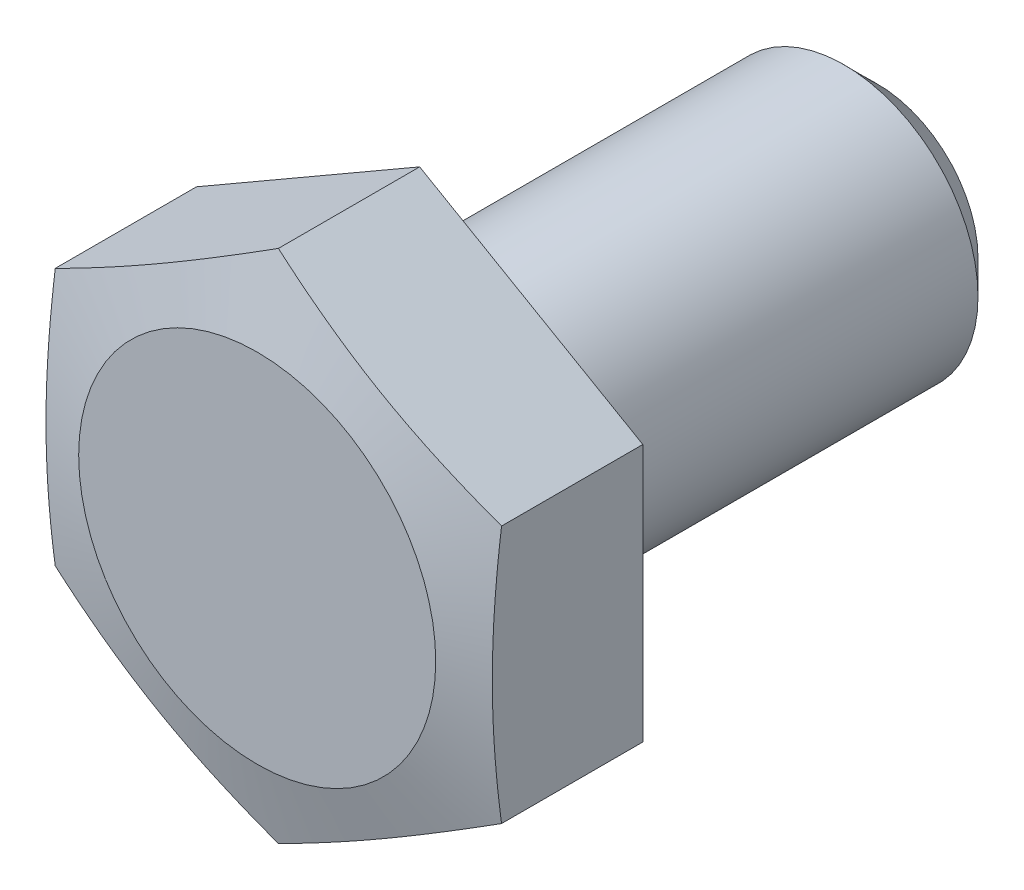
ISO-10303-21;
HEADER;
FILE_DESCRIPTION(('STEP AP214'),'2;1');
FILE_NAME('part.step','',(''),(''),'','','');
FILE_SCHEMA(('AUTOMOTIVE_DESIGN { 1 0 10303 214 1 1 1 1 }'));
ENDSEC;
DATA;
#1=APPLICATION_CONTEXT('core data for automotive mechanical design processes');
#2=APPLICATION_PROTOCOL_DEFINITION('international standard','automotive_design',2000,#1);
#3=PRODUCT_CONTEXT('',#1,'mechanical');
#4=PRODUCT('Part','Part','',(#3));
#5=PRODUCT_RELATED_PRODUCT_CATEGORY('part','',(#4));
#6=PRODUCT_DEFINITION_FORMATION('','',#4);
#7=PRODUCT_DEFINITION_CONTEXT('part definition',#1,'design');
#8=PRODUCT_DEFINITION('design','',#6,#7);
#9=PRODUCT_DEFINITION_SHAPE('','',#8);
#10=(LENGTH_UNIT() NAMED_UNIT(*) SI_UNIT(.MILLI.,.METRE.));
#11=(NAMED_UNIT(*) PLANE_ANGLE_UNIT() SI_UNIT($,.RADIAN.));
#12=(NAMED_UNIT(*) SI_UNIT($,.STERADIAN.) SOLID_ANGLE_UNIT());
#13=UNCERTAINTY_MEASURE_WITH_UNIT(LENGTH_MEASURE(1.E-05),#10,'distance_accuracy_value','');
#14=(GEOMETRIC_REPRESENTATION_CONTEXT(3) GLOBAL_UNCERTAINTY_ASSIGNED_CONTEXT((#13)) GLOBAL_UNIT_ASSIGNED_CONTEXT((#10,
#11,#12)) REPRESENTATION_CONTEXT('',''));
#15=CARTESIAN_POINT('',(0.,0.,0.));
#16=DIRECTION('',(0.,0.,1.));
#17=DIRECTION('',(1.,0.,0.));
#18=AXIS2_PLACEMENT_3D('',#15,#16,#17);
#19=CARTESIAN_POINT('',(0.,0.,0.));
#20=DIRECTION('',(0.,0.,1.));
#21=DIRECTION('',(1.,0.,0.));
#22=AXIS2_PLACEMENT_3D('',#19,#20,#21);
#23=PLANE('',#22);
#24=CARTESIAN_POINT('',(0.,0.,0.));
#25=DIRECTION('',(0.,0.,1.));
#26=DIRECTION('',(1.,0.,0.));
#27=AXIS2_PLACEMENT_3D('',#24,#25,#26);
#28=CIRCLE('',#27,3.1);
#29=CARTESIAN_POINT('',(3.1,0.,0.));
#30=VERTEX_POINT('',#29);
#31=EDGE_CURVE('E66',#30,#30,#28,.T.);
#32=ORIENTED_EDGE('',*,*,#31,.T.);
#33=EDGE_LOOP('',(#32));
#34=FACE_BOUND('',#33,.T.);
#35=CARTESIAN_POINT('',(0.,0.,0.));
#36=DIRECTION('',(0.,0.,1.));
#37=DIRECTION('',(1.,0.,0.));
#38=AXIS2_PLACEMENT_3D('',#35,#36,#37);
#39=CIRCLE('',#38,4.5);
#40=CARTESIAN_POINT('',(4.5,0.,0.));
#41=VERTEX_POINT('',#40);
#42=EDGE_CURVE('E362',#41,#41,#39,.T.);
#43=ORIENTED_EDGE('',*,*,#42,.F.);
#44=EDGE_LOOP('',(#43));
#45=FACE_BOUND('',#44,.T.);
#46=ADVANCED_FACE('F58',(#34,#45),#23,.F.);
#47=CARTESIAN_POINT('',(0.,0.,-10.));
#48=DIRECTION('',(0.,0.,1.));
#49=DIRECTION('',(1.,0.,0.));
#50=AXIS2_PLACEMENT_3D('',#47,#48,#49);
#51=CYLINDRICAL_SURFACE('',#50,3.);
#52=CARTESIAN_POINT('',(0.,0.,-0.0999999999999994));
#53=DIRECTION('',(0.,0.,1.));
#54=DIRECTION('',(1.,0.,0.));
#55=AXIS2_PLACEMENT_3D('',#52,#53,#54);
#56=CIRCLE('',#55,3.);
#57=CARTESIAN_POINT('',(3.,0.,-0.0999999999999994));
#58=VERTEX_POINT('',#57);
#59=EDGE_CURVE('E13',#58,#58,#56,.F.);
#60=ORIENTED_EDGE('',*,*,#59,.T.);
#61=EDGE_LOOP('',(#60));
#62=FACE_BOUND('',#61,.T.);
#63=CARTESIAN_POINT('',(0.,0.,-9.24999999999999));
#64=DIRECTION('',(0.,0.,1.));
#65=DIRECTION('',(1.,0.,0.));
#66=AXIS2_PLACEMENT_3D('',#63,#64,#65);
#67=CIRCLE('',#66,3.);
#68=CARTESIAN_POINT('',(3.,0.,-9.24999999999999));
#69=VERTEX_POINT('',#68);
#70=EDGE_CURVE('E147',#69,#69,#67,.T.);
#71=ORIENTED_EDGE('',*,*,#70,.T.);
#72=EDGE_LOOP('',(#71));
#73=FACE_BOUND('',#72,.T.);
#74=ADVANCED_FACE('F168',(#62,#73),#51,.T.);
#75=CARTESIAN_POINT('',(0.,0.,-10.));
#76=DIRECTION('',(0.,0.,1.));
#77=DIRECTION('',(1.,0.,0.));
#78=AXIS2_PLACEMENT_3D('',#75,#76,#77);
#79=PLANE('',#78);
#80=CARTESIAN_POINT('',(0.,0.,-10.));
#81=DIRECTION('',(0.,0.,1.));
#82=DIRECTION('',(1.,0.,0.));
#83=AXIS2_PLACEMENT_3D('',#80,#81,#82);
#84=CIRCLE('',#83,2.24999999999999);
#85=CARTESIAN_POINT('',(2.24999999999999,0.,-10.));
#86=VERTEX_POINT('',#85);
#87=EDGE_CURVE('E117',#86,#86,#84,.F.);
#88=ORIENTED_EDGE('',*,*,#87,.T.);
#89=EDGE_LOOP('',(#88));
#90=FACE_BOUND('',#89,.T.);
#91=ADVANCED_FACE('F173',(#90),#79,.F.);
#92=CARTESIAN_POINT('',(0.,0.,-9.24999999999999));
#93=DIRECTION('',(0.,0.,1.));
#94=DIRECTION('',(1.,0.,0.));
#95=AXIS2_PLACEMENT_3D('',#92,#93,#94);
#96=CONICAL_SURFACE('',#95,3.,0.785398163397453);
#97=CARTESIAN_POINT('',(2.24999999999999,0.,-10.));
#98=CARTESIAN_POINT('',(2.25781249999999,0.,-9.9921875));
#99=CARTESIAN_POINT('',(2.26562499999999,0.,-9.984375));
#100=CARTESIAN_POINT('',(2.28124999999999,0.,-9.96875));
#101=CARTESIAN_POINT('',(2.28906249999999,0.,-9.9609375));
#102=CARTESIAN_POINT('',(2.30468749999999,0.,-9.9453125));
#103=CARTESIAN_POINT('',(2.31249999999999,0.,-9.9375));
#104=CARTESIAN_POINT('',(2.32812499999999,0.,-9.921875));
#105=CARTESIAN_POINT('',(2.33593749999999,0.,-9.9140625));
#106=CARTESIAN_POINT('',(2.35156249999999,0.,-9.8984375));
#107=CARTESIAN_POINT('',(2.35937499999999,0.,-9.890625));
#108=CARTESIAN_POINT('',(2.37499999999999,0.,-9.875));
#109=CARTESIAN_POINT('',(2.38281249999999,0.,-9.8671875));
#110=CARTESIAN_POINT('',(2.39843749999999,0.,-9.8515625));
#111=CARTESIAN_POINT('',(2.40624999999999,0.,-9.84375));
#112=CARTESIAN_POINT('',(2.42187499999999,0.,-9.828125));
#113=CARTESIAN_POINT('',(2.42968749999999,0.,-9.8203125));
#114=CARTESIAN_POINT('',(2.44531249999999,0.,-9.8046875));
#115=CARTESIAN_POINT('',(2.45312499999999,0.,-9.796875));
#116=CARTESIAN_POINT('',(2.46874999999999,0.,-9.78125));
#117=CARTESIAN_POINT('',(2.47656249999999,0.,-9.7734375));
#118=CARTESIAN_POINT('',(2.49218749999999,0.,-9.7578125));
#119=CARTESIAN_POINT('',(2.49999999999999,0.,-9.75));
#120=CARTESIAN_POINT('',(2.51562499999999,0.,-9.734375));
#121=CARTESIAN_POINT('',(2.52343749999999,0.,-9.7265625));
#122=CARTESIAN_POINT('',(2.53906249999999,0.,-9.7109375));
#123=CARTESIAN_POINT('',(2.54687499999999,0.,-9.703125));
#124=CARTESIAN_POINT('',(2.56249999999999,0.,-9.6875));
#125=CARTESIAN_POINT('',(2.57031249999999,0.,-9.6796875));
#126=CARTESIAN_POINT('',(2.58593749999999,0.,-9.6640625));
#127=CARTESIAN_POINT('',(2.59374999999999,0.,-9.65625));
#128=CARTESIAN_POINT('',(2.60937499999999,0.,-9.640625));
#129=CARTESIAN_POINT('',(2.61718749999999,0.,-9.6328125));
#130=CARTESIAN_POINT('',(2.63281249999999,0.,-9.6171875));
#131=CARTESIAN_POINT('',(2.64062499999999,0.,-9.609375));
#132=CARTESIAN_POINT('',(2.65624999999999,0.,-9.59375));
#133=CARTESIAN_POINT('',(2.66406249999999,0.,-9.5859375));
#134=CARTESIAN_POINT('',(2.67968749999999,0.,-9.5703125));
#135=CARTESIAN_POINT('',(2.68749999999999,0.,-9.5625));
#136=CARTESIAN_POINT('',(2.70312499999999,0.,-9.546875));
#137=CARTESIAN_POINT('',(2.71093749999999,0.,-9.5390625));
#138=CARTESIAN_POINT('',(2.7265625,0.,-9.5234375));
#139=CARTESIAN_POINT('',(2.734375,0.,-9.515625));
#140=CARTESIAN_POINT('',(2.75,0.,-9.5));
#141=CARTESIAN_POINT('',(2.7578125,0.,-9.4921875));
#142=CARTESIAN_POINT('',(2.7734375,0.,-9.4765625));
#143=CARTESIAN_POINT('',(2.78125,0.,-9.46875));
#144=CARTESIAN_POINT('',(2.796875,0.,-9.453125));
#145=CARTESIAN_POINT('',(2.8046875,0.,-9.4453125));
#146=CARTESIAN_POINT('',(2.8203125,0.,-9.4296875));
#147=CARTESIAN_POINT('',(2.828125,0.,-9.421875));
#148=CARTESIAN_POINT('',(2.84375,0.,-9.40625));
#149=CARTESIAN_POINT('',(2.8515625,0.,-9.3984375));
#150=CARTESIAN_POINT('',(2.8671875,0.,-9.38281249999999));
#151=CARTESIAN_POINT('',(2.875,0.,-9.375));
#152=CARTESIAN_POINT('',(2.890625,0.,-9.359375));
#153=CARTESIAN_POINT('',(2.8984375,0.,-9.35156249999999));
#154=CARTESIAN_POINT('',(2.9140625,0.,-9.33593749999999));
#155=CARTESIAN_POINT('',(2.921875,0.,-9.328125));
#156=CARTESIAN_POINT('',(2.9375,0.,-9.3125));
#157=CARTESIAN_POINT('',(2.9453125,0.,-9.30468749999999));
#158=CARTESIAN_POINT('',(2.9609375,0.,-9.28906249999999));
#159=CARTESIAN_POINT('',(2.96875,0.,-9.28125));
#160=CARTESIAN_POINT('',(2.984375,0.,-9.26562499999999));
#161=CARTESIAN_POINT('',(2.9921875,0.,-9.25781249999999));
#162=CARTESIAN_POINT('',(3.,0.,-9.24999999999999));
#163=B_SPLINE_CURVE_WITH_KNOTS('',3,(#97,#98,#99,#100,#101,#102,#103,#104,#105,#106,#107,#108,
#109,#110,#111,#112,#113,#114,#115,#116,#117,#118,#119,#120,#121,#122,#123,#124,#125,#126,#127,
#128,#129,#130,#131,#132,#133,#134,#135,#136,#137,#138,#139,#140,#141,#142,#143,#144,#145,#146,
#147,#148,#149,#150,#151,#152,#153,#154,#155,#156,#157,#158,#159,#160,#161,#162),.UNSPECIFIED.,
.F.,.F.,(4,2,2,2,2,2,2,2,2,2,2,2,2,2,2,2,2,2,2,2,2,2,2,2,2,2,2,2,2,2,2,2,4),(0.,
0.0331456303681191,0.0662912607362395,0.0994368911043586,0.132582521472479,0.165728151840599,
0.198873782208718,0.232019412576839,0.265165042944958,0.298310673313078,0.331456303681197,
0.364601934049318,0.397747564417438,0.430893194785557,0.464038825153678,0.497184455521797,
0.530330085889917,0.563475716258037,0.596621346626156,0.629766976994277,0.662912607362396,
0.696058237730516,0.729203868098636,0.762349498466756,0.795495128834876,0.828640759202995,
0.861786389571115,0.894932019939235,0.928077650307355,0.961223280675475,0.994368911043594,
1.02751454141171,1.06066017177983),.UNSPECIFIED.);
#164=EDGE_CURVE('BSEAM241',#86,#69,#163,.T.);
#165=ORIENTED_EDGE('',*,*,#87,.F.);
#166=ORIENTED_EDGE('',*,*,#70,.F.);
#167=ORIENTED_EDGE('',*,*,#164,.T.);
#168=ORIENTED_EDGE('',*,*,#164,.F.);
#169=EDGE_LOOP('',(#165,#167,#166,#168));
#170=FACE_BOUND('',#169,.T.);
#171=ADVANCED_FACE('F241',(#170),#96,.T.);
#172=CARTESIAN_POINT('',(0.,0.,0.26));
#173=DIRECTION('',(0.,0.,1.));
#174=DIRECTION('',(1.,0.,0.));
#175=AXIS2_PLACEMENT_3D('',#172,#173,#174);
#176=PLANE('',#175);
#177=CARTESIAN_POINT('',(0.,0.,0.26));
#178=DIRECTION('',(0.,0.,1.));
#179=DIRECTION('',(1.,0.,0.));
#180=AXIS2_PLACEMENT_3D('',#177,#178,#179);
#181=CIRCLE('',#180,4.5);
#182=CARTESIAN_POINT('',(4.5,0.,0.26));
#183=VERTEX_POINT('',#182);
#184=EDGE_CURVE('E127',#183,#183,#181,.T.);
#185=ORIENTED_EDGE('',*,*,#184,.T.);
#186=EDGE_LOOP('',(#185));
#187=FACE_BOUND('',#186,.T.);
#188=DIRECTION('',(0.,1.,0.));
#189=VECTOR('',#188,1.);
#190=CARTESIAN_POINT('',(5.,-2.88675134594813,0.26));
#191=LINE('',#190,#189);
#192=CARTESIAN_POINT('',(5.,-2.88675134594813,0.26));
#193=VERTEX_POINT('',#192);
#194=CARTESIAN_POINT('',(5.,2.88675134594813,0.26));
#195=VERTEX_POINT('',#194);
#196=EDGE_CURVE('E108',#193,#195,#191,.T.);
#197=ORIENTED_EDGE('',*,*,#196,.F.);
#198=DIRECTION('',(0.866025403784439,0.5,0.));
#199=VECTOR('',#198,1.);
#200=CARTESIAN_POINT('',(0.,-5.77350269189626,0.26));
#201=LINE('',#200,#199);
#202=CARTESIAN_POINT('',(0.,-5.77350269189626,0.26));
#203=VERTEX_POINT('',#202);
#204=EDGE_CURVE('E111',#203,#193,#201,.T.);
#205=ORIENTED_EDGE('',*,*,#204,.F.);
#206=DIRECTION('',(0.866025403784439,-0.5,0.));
#207=VECTOR('',#206,1.);
#208=CARTESIAN_POINT('',(-5.,-2.88675134594813,0.26));
#209=LINE('',#208,#207);
#210=CARTESIAN_POINT('',(-5.,-2.88675134594813,0.26));
#211=VERTEX_POINT('',#210);
#212=EDGE_CURVE('E126',#211,#203,#209,.T.);
#213=ORIENTED_EDGE('',*,*,#212,.F.);
#214=DIRECTION('',(0.,-1.,0.));
#215=VECTOR('',#214,1.);
#216=CARTESIAN_POINT('',(-5.,2.88675134594813,0.26));
#217=LINE('',#216,#215);
#218=CARTESIAN_POINT('',(-5.,2.88675134594813,0.26));
#219=VERTEX_POINT('',#218);
#220=EDGE_CURVE('E354',#219,#211,#217,.T.);
#221=ORIENTED_EDGE('',*,*,#220,.F.);
#222=DIRECTION('',(-0.866025403784439,-0.5,0.));
#223=VECTOR('',#222,1.);
#224=CARTESIAN_POINT('',(0.,5.77350269189626,0.26));
#225=LINE('',#224,#223);
#226=CARTESIAN_POINT('',(0.,5.77350269189626,0.26));
#227=VERTEX_POINT('',#226);
#228=EDGE_CURVE('E357',#227,#219,#225,.T.);
#229=ORIENTED_EDGE('',*,*,#228,.F.);
#230=DIRECTION('',(-0.866025403784439,0.5,0.));
#231=VECTOR('',#230,1.);
#232=CARTESIAN_POINT('',(5.,2.88675134594813,0.26));
#233=LINE('',#232,#231);
#234=EDGE_CURVE('E73',#195,#227,#233,.T.);
#235=ORIENTED_EDGE('',*,*,#234,.F.);
#236=EDGE_LOOP('',(#197,#205,#213,#221,#229,#235));
#237=FACE_BOUND('',#236,.T.);
#238=ADVANCED_FACE('F110',(#187,#237),#176,.F.);
#239=CARTESIAN_POINT('',(0.,0.,0.26));
#240=DIRECTION('',(0.,0.,-1.));
#241=DIRECTION('',(-1.,0.,0.));
#242=AXIS2_PLACEMENT_3D('',#239,#240,#241);
#243=CYLINDRICAL_SURFACE('',#242,4.5);
#244=ORIENTED_EDGE('',*,*,#184,.F.);
#245=EDGE_LOOP('',(#244));
#246=FACE_BOUND('',#245,.T.);
#247=ORIENTED_EDGE('',*,*,#42,.T.);
#248=EDGE_LOOP('',(#247));
#249=FACE_BOUND('',#248,.T.);
#250=ADVANCED_FACE('F248',(#246,#249),#243,.T.);
#251=CARTESIAN_POINT('',(0.,0.,3.9));
#252=DIRECTION('',(0.,0.,1.));
#253=DIRECTION('',(1.,0.,0.));
#254=AXIS2_PLACEMENT_3D('',#251,#252,#253);
#255=PLANE('',#254);
#256=CARTESIAN_POINT('',(0.,0.,3.9));
#257=DIRECTION('',(0.,0.,-1.));
#258=DIRECTION('',(-1.,0.,0.));
#259=AXIS2_PLACEMENT_3D('',#256,#257,#258);
#260=CIRCLE('',#259,4.);
#261=CARTESIAN_POINT('',(-4.,0.,3.9));
#262=VERTEX_POINT('',#261);
#263=EDGE_CURVE('E193',#262,#262,#260,.T.);
#264=ORIENTED_EDGE('',*,*,#263,.F.);
#265=EDGE_LOOP('',(#264));
#266=FACE_BOUND('',#265,.T.);
#267=ADVANCED_FACE('F178',(#266),#255,.T.);
#268=CARTESIAN_POINT('',(0.,0.,3.9));
#269=DIRECTION('',(0.,0.,-1.));
#270=DIRECTION('',(-1.,0.,0.));
#271=AXIS2_PLACEMENT_3D('',#268,#269,#270);
#272=CONICAL_SURFACE('',#271,4.,1.30899693899575);
#273=ORIENTED_EDGE('',*,*,#263,.T.);
#274=EDGE_LOOP('',(#273));
#275=FACE_BOUND('',#274,.T.);
#276=CARTESIAN_POINT('',(-5.0002,2.88663587589429,3.42476044489613));
#277=CARTESIAN_POINT('',(-4.79254599569434,3.00652497117847,3.45689871138588));
#278=CARTESIAN_POINT('',(-4.58451548167429,3.1266314444476,3.48607499454545));
#279=CARTESIAN_POINT('',(-4.16771975103018,3.36726857173206,3.53733503738883));
#280=CARTESIAN_POINT('',(-3.95895427067026,3.48779937801537,3.55941591599972));
#281=CARTESIAN_POINT('',(-3.54195440146031,3.72855436475577,3.59519603972269));
#282=CARTESIAN_POINT('',(-3.33372283258692,3.8487769170986,3.6089379557021));
#283=CARTESIAN_POINT('',(-2.91699413634292,4.08937534205412,3.62736446336494));
#284=CARTESIAN_POINT('',(-2.70849706817146,4.20975118048816,3.63205080756888));
#285=CARTESIAN_POINT('',(-2.29150293182854,4.45050285735623,3.63205080756888));
#286=CARTESIAN_POINT('',(-2.08300586365708,4.57087869579027,3.62736446336494));
#287=CARTESIAN_POINT('',(-1.66627716741308,4.81147712074579,3.6089379557021));
#288=CARTESIAN_POINT('',(-1.45804559853969,4.93169967308862,3.59519603972269));
#289=CARTESIAN_POINT('',(-1.04104572932974,5.17245465982902,3.55941591599972));
#290=CARTESIAN_POINT('',(-0.832280248969818,5.29298546611233,3.53733503738883));
#291=CARTESIAN_POINT('',(-0.415484518325708,5.53362259339679,3.48607499454545));
#292=CARTESIAN_POINT('',(-0.207454004305664,5.65372906666592,3.45689871138588));
#293=CARTESIAN_POINT('',(0.000200000000000952,5.7736181619501,3.42476044489613));
#294=B_SPLINE_CURVE_WITH_KNOTS('',3,(#276,#277,#278,#279,#280,#281,#282,#283,#284,#285,#286,
#287,#288,#289,#290,#291,#292,#293),.UNSPECIFIED.,.F.,.F.,(4,2,2,2,2,2,2,2,4),(0.,
0.725805237679808,1.45190481561532,2.17425686883392,2.89646911159516,3.6186813543564,
4.34103340757501,5.06713298551051,5.79293822319032),.UNSPECIFIED.);
#295=CARTESIAN_POINT('',(-5.,2.88675134594813,3.42479138593199));
#296=VERTEX_POINT('',#295);
#297=CARTESIAN_POINT('',(0.,5.77350269189626,3.42479138593199));
#298=VERTEX_POINT('',#297);
#299=EDGE_CURVE('E224',#296,#298,#294,.T.);
#300=ORIENTED_EDGE('',*,*,#299,.F.);
#301=CARTESIAN_POINT('',(-5.,-7.71938857293575,2.50740758007849));
#302=CARTESIAN_POINT('',(-5.,-7.49147427168933,2.5586506711407));
#303=CARTESIAN_POINT('',(-5.,-7.26341962327938,2.60928049818289));
#304=CARTESIAN_POINT('',(-5.,-6.80696046487182,2.70898221683248));
#305=CARTESIAN_POINT('',(-5.,-6.57855594068918,2.75805404342194));
#306=CARTESIAN_POINT('',(-5.,-6.12114081846093,2.85434740009249));
#307=CARTESIAN_POINT('',(-5.,-5.89212985971082,2.9015672227117));
#308=CARTESIAN_POINT('',(-5.,-5.43363694023774,2.99366077539556));
#309=CARTESIAN_POINT('',(-5.,-5.20415498336043,3.03853452453708));
#310=CARTESIAN_POINT('',(-5.,-4.74669561473332,3.12498601768013));
#311=CARTESIAN_POINT('',(-5.,-4.51872312275535,3.16658966965695));
#312=CARTESIAN_POINT('',(-5.,-4.06216118292291,3.24625518987446));
#313=CARTESIAN_POINT('',(-5.,-3.83357174836871,3.28431713385075));
#314=CARTESIAN_POINT('',(-5.,-3.37571675111581,3.35606117758773));
#315=CARTESIAN_POINT('',(-5.,-3.14645123580777,3.38974357720939));
#316=CARTESIAN_POINT('',(-5.,-2.68718848722816,3.45175097196975));
#317=CARTESIAN_POINT('',(-5.,-2.45719125269116,3.48007595783829));
#318=CARTESIAN_POINT('',(-5.,-1.99381235919122,3.53058841201233));
#319=CARTESIAN_POINT('',(-5.,-1.76042239852366,3.55270084172098));
#320=CARTESIAN_POINT('',(-5.,-1.29303834898082,3.58927121142274));
#321=CARTESIAN_POINT('',(-5.,-1.05904427428246,3.60372932943009));
#322=CARTESIAN_POINT('',(-5.,-0.590803464055625,3.62414927679565));
#323=CARTESIAN_POINT('',(-5.,-0.356556930570833,3.63011564576264));
#324=CARTESIAN_POINT('',(-5.,0.1119950018632,3.63318477990246));
#325=CARTESIAN_POINT('',(-5.,0.346300400708154,3.63028756066898));
#326=CARTESIAN_POINT('',(-5.,0.815702332550344,3.6157848044719));
#327=CARTESIAN_POINT('',(-5.,1.05079761908674,3.60413973435184));
#328=CARTESIAN_POINT('',(-5.,1.52045390424001,3.57280431062971));
#329=CARTESIAN_POINT('',(-5.,1.7550148730958,3.55311351939736));
#330=CARTESIAN_POINT('',(-5.,2.22359969488492,3.50670213839425));
#331=CARTESIAN_POINT('',(-5.,2.45762304038479,3.47997650447177));
#332=CARTESIAN_POINT('',(-5.,2.92491072170449,3.42063342174126));
#333=CARTESIAN_POINT('',(-5.,3.15817506053191,3.38801599630868));
#334=CARTESIAN_POINT('',(-5.,3.67089843043664,3.31090516163662));
#335=CARTESIAN_POINT('',(-5.,3.95019552214342,3.2653430589873));
#336=CARTESIAN_POINT('',(-5.,4.5078641671335,3.16884457136917));
#337=CARTESIAN_POINT('',(-5.,4.78623567003497,3.11790789863514));
#338=CARTESIAN_POINT('',(-5.,5.34224429024145,3.01189120228595));
#339=CARTESIAN_POINT('',(-5.,5.61988124068023,2.95681030902665));
#340=CARTESIAN_POINT('',(-5.,6.1744943954023,2.84345950223111));
#341=CARTESIAN_POINT('',(-5.,6.4514706124489,2.78518965082479));
#342=CARTESIAN_POINT('',(-5.,7.0050486624742,2.66613430078371));
#343=CARTESIAN_POINT('',(-5.,7.28165018383369,2.60534735809867));
#344=CARTESIAN_POINT('',(-5.,7.83441649328104,2.4818160373549));
#345=CARTESIAN_POINT('',(-5.,8.11058127842605,2.41907164616488));
#346=CARTESIAN_POINT('',(-5.,8.93847178761893,2.2285435952327));
#347=CARTESIAN_POINT('',(-5.,9.48966522946674,2.09844942786497));
#348=CARTESIAN_POINT('',(-5.,10.5827319287434,1.83626115900039));
#349=CARTESIAN_POINT('',(-5.,11.1246197407943,1.70422732451607));
#350=CARTESIAN_POINT('',(-5.,12.2077528662115,1.43746864765053));
#351=CARTESIAN_POINT('',(-5.,12.7489981551808,1.30274370634371));
#352=CARTESIAN_POINT('',(-5.,13.8299959758578,1.03164505898908));
#353=CARTESIAN_POINT('',(-5.,14.3697494036634,0.895274918043513));
#354=CARTESIAN_POINT('',(-5.,15.4488678627502,0.621114449919813));
#355=CARTESIAN_POINT('',(-5.,15.9882329115673,0.483324191805858));
#356=CARTESIAN_POINT('',(-5.,16.5274739773435,0.34505516170082));
#357=B_SPLINE_CURVE_WITH_KNOTS('',3,(#301,#302,#303,#304,#305,#306,#307,#308,#309,#310,#311,
#312,#313,#314,#315,#316,#317,#318,#319,#320,#321,#322,#323,#324,#325,#326,#327,#328,#329,#330,
#331,#332,#333,#334,#335,#336,#337,#338,#339,#340,#341,#342,#343,#344,#345,#346,#347,#348,#349,
#350,#351,#352,#353,#354,#355,#356),.UNSPECIFIED.,.F.,.F.,(4,2,2,2,2,2,2,2,2,2,2,2,2,2,2,2,2,2,
2,2,2,2,2,2,2,2,2,4),(0.,0.700814460777488,1.40165812936402,2.10313344179458,2.80460304935615,
3.49979359532529,4.19496927197792,4.89009732587981,5.58522658257885,6.28842261062312,
6.99160228390911,7.6944059026078,8.39720828486562,9.10320601298499,9.80924214749582,
10.5157859125011,11.2223268743828,12.0712227288488,12.9201640579817,13.7692840327893,
14.6183874702216,15.4679849751964,16.3175881808191,18.0165748535255,19.6897908742068,
21.3630685162348,23.0332087424935,24.7032681249786),.UNSPECIFIED.);
#358=CARTESIAN_POINT('',(-5.,-2.88675134594813,3.42479138593199));
#359=VERTEX_POINT('',#358);
#360=EDGE_CURVE('E217',#359,#296,#357,.T.);
#361=ORIENTED_EDGE('',*,*,#360,.F.);
#362=CARTESIAN_POINT('',(0.000200000000000598,-5.7736181619501,3.42476044489613));
#363=CARTESIAN_POINT('',(-0.207454004305664,-5.65372906666592,3.45689871138588));
#364=CARTESIAN_POINT('',(-0.415484518325707,-5.53362259339679,3.48607499454545));
#365=CARTESIAN_POINT('',(-0.832280248969817,-5.29298546611233,3.53733503738883));
#366=CARTESIAN_POINT('',(-1.04104572932974,-5.17245465982902,3.55941591599972));
#367=CARTESIAN_POINT('',(-1.45804559853969,-4.93169967308862,3.59519603972269));
#368=CARTESIAN_POINT('',(-1.66627716741308,-4.81147712074579,3.6089379557021));
#369=CARTESIAN_POINT('',(-2.08300586365708,-4.57087869579027,3.62736446336494));
#370=CARTESIAN_POINT('',(-2.29150293182854,-4.45050285735623,3.63205080756888));
#371=CARTESIAN_POINT('',(-2.70849706817146,-4.20975118048815,3.63205080756888));
#372=CARTESIAN_POINT('',(-2.91699413634292,-4.08937534205412,3.62736446336494));
#373=CARTESIAN_POINT('',(-3.33372283258692,-3.8487769170986,3.6089379557021));
#374=CARTESIAN_POINT('',(-3.54195440146031,-3.72855436475577,3.59519603972269));
#375=CARTESIAN_POINT('',(-3.95895427067026,-3.48779937801536,3.55941591599972));
#376=CARTESIAN_POINT('',(-4.16771975103018,-3.36726857173206,3.53733503738883));
#377=CARTESIAN_POINT('',(-4.58451548167429,-3.1266314444476,3.48607499454545));
#378=CARTESIAN_POINT('',(-4.79254599569433,-3.00652497117847,3.45689871138588));
#379=CARTESIAN_POINT('',(-5.0002,-2.88663587589429,3.42476044489613));
#380=B_SPLINE_CURVE_WITH_KNOTS('',3,(#362,#363,#364,#365,#366,#367,#368,#369,#370,#371,#372,
#373,#374,#375,#376,#377,#378,#379),.UNSPECIFIED.,.F.,.F.,(4,2,2,2,2,2,2,2,4),(0.,
0.725805237679808,1.45190481561532,2.17425686883392,2.89646911159516,3.6186813543564,
4.34103340757501,5.06713298551051,5.79293822319032),.UNSPECIFIED.);
#381=CARTESIAN_POINT('',(0.,-5.77350269189626,3.42479138593199));
#382=VERTEX_POINT('',#381);
#383=EDGE_CURVE('E211',#382,#359,#380,.T.);
#384=ORIENTED_EDGE('',*,*,#383,.F.);
#385=CARTESIAN_POINT('',(5.0002,-2.88663587589429,3.42476044489613));
#386=CARTESIAN_POINT('',(4.79254599569433,-3.00652497117847,3.45689871138588));
#387=CARTESIAN_POINT('',(4.58451548167429,-3.1266314444476,3.48607499454545));
#388=CARTESIAN_POINT('',(4.16771975103018,-3.36726857173207,3.53733503738883));
#389=CARTESIAN_POINT('',(3.95895427067026,-3.48779937801537,3.55941591599972));
#390=CARTESIAN_POINT('',(3.54195440146031,-3.72855436475577,3.59519603972269));
#391=CARTESIAN_POINT('',(3.33372283258692,-3.8487769170986,3.6089379557021));
#392=CARTESIAN_POINT('',(2.91699413634291,-4.08937534205412,3.62736446336494));
#393=CARTESIAN_POINT('',(2.70849706817146,-4.20975118048816,3.63205080756888));
#394=CARTESIAN_POINT('',(2.29150293182854,-4.45050285735624,3.63205080756888));
#395=CARTESIAN_POINT('',(2.08300586365709,-4.57087869579027,3.62736446336494));
#396=CARTESIAN_POINT('',(1.66627716741308,-4.81147712074579,3.6089379557021));
#397=CARTESIAN_POINT('',(1.45804559853969,-4.93169967308862,3.59519603972269));
#398=CARTESIAN_POINT('',(1.04104572932974,-5.17245465982903,3.55941591599972));
#399=CARTESIAN_POINT('',(0.832280248969819,-5.29298546611233,3.53733503738883));
#400=CARTESIAN_POINT('',(0.415484518325708,-5.53362259339679,3.48607499454545));
#401=CARTESIAN_POINT('',(0.207454004305665,-5.65372906666592,3.45689871138588));
#402=CARTESIAN_POINT('',(-0.000199999999999693,-5.7736181619501,3.42476044489613));
#403=B_SPLINE_CURVE_WITH_KNOTS('',3,(#385,#386,#387,#388,#389,#390,#391,#392,#393,#394,#395,
#396,#397,#398,#399,#400,#401,#402),.UNSPECIFIED.,.F.,.F.,(4,2,2,2,2,2,2,2,4),(0.,
0.725805237679808,1.45190481561532,2.17425686883392,2.89646911159516,3.6186813543564,
4.341033407575,5.06713298551051,5.79293822319032),.UNSPECIFIED.);
#404=CARTESIAN_POINT('',(5.,-2.88675134594813,3.42479138593199));
#405=VERTEX_POINT('',#404);
#406=EDGE_CURVE('E81',#405,#382,#403,.T.);
#407=ORIENTED_EDGE('',*,*,#406,.F.);
#408=CARTESIAN_POINT('',(5.,-7.71938857293575,2.50740758007849));
#409=CARTESIAN_POINT('',(5.,-7.49147427168934,2.5586506711407));
#410=CARTESIAN_POINT('',(5.,-7.26341962327938,2.60928049818289));
#411=CARTESIAN_POINT('',(5.,-6.80696046487183,2.70898221683248));
#412=CARTESIAN_POINT('',(5.,-6.57855594068919,2.75805404342194));
#413=CARTESIAN_POINT('',(5.,-6.12114081846093,2.85434740009249));
#414=CARTESIAN_POINT('',(5.,-5.89212985971083,2.9015672227117));
#415=CARTESIAN_POINT('',(5.,-5.43363694023775,2.99366077539556));
#416=CARTESIAN_POINT('',(5.,-5.20415498336043,3.03853452453708));
#417=CARTESIAN_POINT('',(5.,-4.74669561473333,3.12498601768013));
#418=CARTESIAN_POINT('',(5.,-4.51872312275535,3.16658966965695));
#419=CARTESIAN_POINT('',(5.,-4.06216118292291,3.24625518987446));
#420=CARTESIAN_POINT('',(5.,-3.83357174836871,3.28431713385075));
#421=CARTESIAN_POINT('',(5.,-3.37571675111582,3.35606117758773));
#422=CARTESIAN_POINT('',(5.,-3.14645123580777,3.38974357720939));
#423=CARTESIAN_POINT('',(5.,-2.68718848722816,3.45175097196975));
#424=CARTESIAN_POINT('',(5.,-2.45719125269117,3.48007595783829));
#425=CARTESIAN_POINT('',(5.,-1.99381235919123,3.53058841201233));
#426=CARTESIAN_POINT('',(5.,-1.76042239852366,3.55270084172098));
#427=CARTESIAN_POINT('',(5.,-1.29303834898083,3.58927121142274));
#428=CARTESIAN_POINT('',(5.,-1.05904427428246,3.6037293294301));
#429=CARTESIAN_POINT('',(5.,-0.59080346405563,3.62414927679565));
#430=CARTESIAN_POINT('',(5.,-0.356556930570837,3.63011564576264));
#431=CARTESIAN_POINT('',(5.,0.111995001863196,3.63318477990246));
#432=CARTESIAN_POINT('',(5.,0.34630040070815,3.63028756066898));
#433=CARTESIAN_POINT('',(5.,0.81570233255034,3.6157848044719));
#434=CARTESIAN_POINT('',(5.,1.05079761908674,3.60413973435184));
#435=CARTESIAN_POINT('',(5.,1.52045390424001,3.57280431062971));
#436=CARTESIAN_POINT('',(5.,1.75501487309579,3.55311351939736));
#437=CARTESIAN_POINT('',(5.,2.22359969488492,3.50670213839425));
#438=CARTESIAN_POINT('',(5.,2.45762304038479,3.47997650447177));
#439=CARTESIAN_POINT('',(5.,2.92491072170449,3.42063342174126));
#440=CARTESIAN_POINT('',(5.,3.15817506053191,3.38801599630868));
#441=CARTESIAN_POINT('',(5.,3.67089843043664,3.31090516163663));
#442=CARTESIAN_POINT('',(5.,3.95019552214341,3.2653430589873));
#443=CARTESIAN_POINT('',(5.,4.5078641671335,3.16884457136917));
#444=CARTESIAN_POINT('',(5.,4.78623567003497,3.11790789863514));
#445=CARTESIAN_POINT('',(5.,5.34224429024145,3.01189120228595));
#446=CARTESIAN_POINT('',(5.,5.61988124068023,2.95681030902665));
#447=CARTESIAN_POINT('',(5.,6.17449439540229,2.84345950223111));
#448=CARTESIAN_POINT('',(5.,6.45147061244889,2.78518965082479));
#449=CARTESIAN_POINT('',(5.,7.0050486624742,2.66613430078371));
#450=CARTESIAN_POINT('',(5.,7.28165018383368,2.60534735809867));
#451=CARTESIAN_POINT('',(5.,7.83441649328104,2.48181603735491));
#452=CARTESIAN_POINT('',(5.,8.11058127842605,2.41907164616488));
#453=CARTESIAN_POINT('',(5.,8.93847178761892,2.2285435952327));
#454=CARTESIAN_POINT('',(5.,9.48966522946674,2.09844942786497));
#455=CARTESIAN_POINT('',(5.,10.5827319287434,1.83626115900039));
#456=CARTESIAN_POINT('',(5.,11.1246197407943,1.70422732451607));
#457=CARTESIAN_POINT('',(5.,12.2077528662115,1.43746864765053));
#458=CARTESIAN_POINT('',(5.,12.7489981551808,1.30274370634371));
#459=CARTESIAN_POINT('',(5.,13.8299959758578,1.03164505898908));
#460=CARTESIAN_POINT('',(5.,14.3697494036634,0.895274918043512));
#461=CARTESIAN_POINT('',(5.,15.4488678627503,0.621114449919811));
#462=CARTESIAN_POINT('',(5.,15.9882329115673,0.483324191805856));
#463=CARTESIAN_POINT('',(5.,16.5274739773435,0.345055161700819));
#464=B_SPLINE_CURVE_WITH_KNOTS('',3,(#408,#409,#410,#411,#412,#413,#414,#415,#416,#417,#418,
#419,#420,#421,#422,#423,#424,#425,#426,#427,#428,#429,#430,#431,#432,#433,#434,#435,#436,#437,
#438,#439,#440,#441,#442,#443,#444,#445,#446,#447,#448,#449,#450,#451,#452,#453,#454,#455,#456,
#457,#458,#459,#460,#461,#462,#463),.UNSPECIFIED.,.F.,.F.,(4,2,2,2,2,2,2,2,2,2,2,2,2,2,2,2,2,2,
2,2,2,2,2,2,2,2,2,4),(0.,0.700814460777487,1.40165812936402,2.10313344179458,2.80460304935614,
3.49979359532529,4.19496927197792,4.89009732587981,5.58522658257885,6.28842261062312,
6.99160228390911,7.6944059026078,8.39720828486562,9.10320601298499,9.80924214749582,
10.5157859125011,11.2223268743828,12.0712227288488,12.9201640579817,13.7692840327893,
14.6183874702216,15.4679849751964,16.3175881808191,18.0165748535255,19.6897908742068,
21.3630685162348,23.0332087424935,24.7032681249786),.UNSPECIFIED.);
#465=CARTESIAN_POINT('',(5.,2.88675134594813,3.42479138593199));
#466=VERTEX_POINT('',#465);
#467=EDGE_CURVE('E130',#466,#405,#464,.F.);
#468=ORIENTED_EDGE('',*,*,#467,.F.);
#469=CARTESIAN_POINT('',(-0.000199999999999493,5.7736181619501,3.42476044489613));
#470=CARTESIAN_POINT('',(0.207454004305665,5.65372906666592,3.45689871138588));
#471=CARTESIAN_POINT('',(0.415484518325708,5.53362259339679,3.48607499454545));
#472=CARTESIAN_POINT('',(0.832280248969819,5.29298546611233,3.53733503738883));
#473=CARTESIAN_POINT('',(1.04104572932974,5.17245465982903,3.55941591599972));
#474=CARTESIAN_POINT('',(1.45804559853969,4.93169967308862,3.59519603972269));
#475=CARTESIAN_POINT('',(1.66627716741308,4.81147712074579,3.6089379557021));
#476=CARTESIAN_POINT('',(2.08300586365709,4.57087869579027,3.62736446336494));
#477=CARTESIAN_POINT('',(2.29150293182854,4.45050285735623,3.63205080756888));
#478=CARTESIAN_POINT('',(2.70849706817146,4.20975118048816,3.63205080756888));
#479=CARTESIAN_POINT('',(2.91699413634291,4.08937534205412,3.62736446336494));
#480=CARTESIAN_POINT('',(3.33372283258692,3.8487769170986,3.6089379557021));
#481=CARTESIAN_POINT('',(3.54195440146031,3.72855436475577,3.59519603972269));
#482=CARTESIAN_POINT('',(3.95895427067026,3.48779937801536,3.55941591599972));
#483=CARTESIAN_POINT('',(4.16771975103018,3.36726857173206,3.53733503738883));
#484=CARTESIAN_POINT('',(4.58451548167429,3.1266314444476,3.48607499454545));
#485=CARTESIAN_POINT('',(4.79254599569433,3.00652497117847,3.45689871138588));
#486=CARTESIAN_POINT('',(5.0002,2.88663587589429,3.42476044489613));
#487=B_SPLINE_CURVE_WITH_KNOTS('',3,(#469,#470,#471,#472,#473,#474,#475,#476,#477,#478,#479,
#480,#481,#482,#483,#484,#485,#486),.UNSPECIFIED.,.F.,.F.,(4,2,2,2,2,2,2,2,4),(0.,
0.725805237679807,1.45190481561531,2.17425686883392,2.89646911159516,3.6186813543564,
4.341033407575,5.06713298551051,5.79293822319032),.UNSPECIFIED.);
#488=EDGE_CURVE('E135',#298,#466,#487,.T.);
#489=ORIENTED_EDGE('',*,*,#488,.F.);
#490=EDGE_LOOP('',(#300,#361,#384,#407,#468,#489));
#491=FACE_BOUND('',#490,.T.);
#492=ADVANCED_FACE('F182',(#275,#491),#272,.T.);
#493=CARTESIAN_POINT('',(5.,-2.88675134594813,3.9));
#494=DIRECTION('',(-1.,0.,0.));
#495=DIRECTION('',(0.,0.,1.));
#496=AXIS2_PLACEMENT_3D('',#493,#494,#495);
#497=PLANE('',#496);
#498=DIRECTION('',(0.,0.,-1.));
#499=VECTOR('',#498,1.);
#500=CARTESIAN_POINT('',(5.,-2.88675134594813,3.9));
#501=LINE('',#500,#499);
#502=EDGE_CURVE('E123',#405,#193,#501,.T.);
#503=ORIENTED_EDGE('',*,*,#502,.T.);
#504=ORIENTED_EDGE('',*,*,#196,.T.);
#505=DIRECTION('',(0.,0.,-1.));
#506=VECTOR('',#505,1.);
#507=CARTESIAN_POINT('',(5.,2.88675134594813,3.9));
#508=LINE('',#507,#506);
#509=EDGE_CURVE('E131',#466,#195,#508,.T.);
#510=ORIENTED_EDGE('',*,*,#509,.F.);
#511=ORIENTED_EDGE('',*,*,#467,.T.);
#512=EDGE_LOOP('',(#503,#504,#510,#511));
#513=FACE_BOUND('',#512,.T.);
#514=ADVANCED_FACE('F129',(#513),#497,.F.);
#515=CARTESIAN_POINT('',(0.,-5.77350269189626,3.9));
#516=DIRECTION('',(-0.5,0.866025403784439,0.));
#517=DIRECTION('',(-0.866025403784439,-0.5,0.));
#518=AXIS2_PLACEMENT_3D('',#515,#516,#517);
#519=PLANE('',#518);
#520=DIRECTION('',(0.,0.,-1.));
#521=VECTOR('',#520,1.);
#522=CARTESIAN_POINT('',(0.,-5.77350269189626,3.9));
#523=LINE('',#522,#521);
#524=EDGE_CURVE('E125',#382,#203,#523,.T.);
#525=ORIENTED_EDGE('',*,*,#524,.T.);
#526=ORIENTED_EDGE('',*,*,#204,.T.);
#527=ORIENTED_EDGE('',*,*,#502,.F.);
#528=ORIENTED_EDGE('',*,*,#406,.T.);
#529=EDGE_LOOP('',(#525,#526,#527,#528));
#530=FACE_BOUND('',#529,.T.);
#531=ADVANCED_FACE('F122',(#530),#519,.F.);
#532=CARTESIAN_POINT('',(-5.,-2.88675134594813,3.9));
#533=DIRECTION('',(0.5,0.866025403784439,0.));
#534=DIRECTION('',(-0.866025403784439,0.5,0.));
#535=AXIS2_PLACEMENT_3D('',#532,#533,#534);
#536=PLANE('',#535);
#537=DIRECTION('',(0.,0.,-1.));
#538=VECTOR('',#537,1.);
#539=CARTESIAN_POINT('',(-5.,-2.88675134594813,3.9));
#540=LINE('',#539,#538);
#541=EDGE_CURVE('E133',#359,#211,#540,.T.);
#542=ORIENTED_EDGE('',*,*,#541,.T.);
#543=ORIENTED_EDGE('',*,*,#212,.T.);
#544=ORIENTED_EDGE('',*,*,#524,.F.);
#545=ORIENTED_EDGE('',*,*,#383,.T.);
#546=EDGE_LOOP('',(#542,#543,#544,#545));
#547=FACE_BOUND('',#546,.T.);
#548=ADVANCED_FACE('F305',(#547),#536,.F.);
#549=CARTESIAN_POINT('',(-5.,2.88675134594813,3.9));
#550=DIRECTION('',(1.,0.,0.));
#551=DIRECTION('',(0.,1.,0.));
#552=AXIS2_PLACEMENT_3D('',#549,#550,#551);
#553=PLANE('',#552);
#554=DIRECTION('',(0.,0.,-1.));
#555=VECTOR('',#554,1.);
#556=CARTESIAN_POINT('',(-5.,2.88675134594813,3.9));
#557=LINE('',#556,#555);
#558=EDGE_CURVE('E141',#296,#219,#557,.T.);
#559=ORIENTED_EDGE('',*,*,#558,.T.);
#560=ORIENTED_EDGE('',*,*,#220,.T.);
#561=ORIENTED_EDGE('',*,*,#541,.F.);
#562=ORIENTED_EDGE('',*,*,#360,.T.);
#563=EDGE_LOOP('',(#559,#560,#561,#562));
#564=FACE_BOUND('',#563,.T.);
#565=ADVANCED_FACE('F237',(#564),#553,.F.);
#566=CARTESIAN_POINT('',(0.,5.77350269189626,3.9));
#567=DIRECTION('',(0.5,-0.866025403784439,0.));
#568=DIRECTION('',(0.866025403784439,0.5,0.));
#569=AXIS2_PLACEMENT_3D('',#566,#567,#568);
#570=PLANE('',#569);
#571=DIRECTION('',(0.,0.,-1.));
#572=VECTOR('',#571,1.);
#573=CARTESIAN_POINT('',(0.,5.77350269189626,3.9));
#574=LINE('',#573,#572);
#575=EDGE_CURVE('E144',#298,#227,#574,.T.);
#576=ORIENTED_EDGE('',*,*,#575,.T.);
#577=ORIENTED_EDGE('',*,*,#228,.T.);
#578=ORIENTED_EDGE('',*,*,#558,.F.);
#579=ORIENTED_EDGE('',*,*,#299,.T.);
#580=EDGE_LOOP('',(#576,#577,#578,#579));
#581=FACE_BOUND('',#580,.T.);
#582=ADVANCED_FACE('F163',(#581),#570,.F.);
#583=CARTESIAN_POINT('',(5.,2.88675134594813,3.9));
#584=DIRECTION('',(-0.5,-0.866025403784438,0.));
#585=DIRECTION('',(0.866025403784439,-0.5,0.));
#586=AXIS2_PLACEMENT_3D('',#583,#584,#585);
#587=PLANE('',#586);
#588=ORIENTED_EDGE('',*,*,#509,.T.);
#589=ORIENTED_EDGE('',*,*,#234,.T.);
#590=ORIENTED_EDGE('',*,*,#575,.F.);
#591=ORIENTED_EDGE('',*,*,#488,.T.);
#592=EDGE_LOOP('',(#588,#589,#590,#591));
#593=FACE_BOUND('',#592,.T.);
#594=ADVANCED_FACE('F157',(#593),#587,.F.);
#595=CARTESIAN_POINT('',(0.,0.,-0.0999999999999994));
#596=DIRECTION('',(0.,0.,1.));
#597=DIRECTION('',(1.,0.,0.));
#598=AXIS2_PLACEMENT_3D('',#595,#596,#597);
#599=TOROIDAL_SURFACE('',#598,3.1,0.1);
#600=ORIENTED_EDGE('',*,*,#59,.F.);
#601=EDGE_LOOP('',(#600));
#602=FACE_BOUND('',#601,.T.);
#603=ORIENTED_EDGE('',*,*,#31,.F.);
#604=EDGE_LOOP('',(#603));
#605=FACE_BOUND('',#604,.T.);
#606=ADVANCED_FACE('F60',(#602,#605),#599,.F.);
#607=CLOSED_SHELL('',(#46,#74,#91,#171,#238,#250,#267,#492,#514,#531,#548,#565,#582,#594,#606));
#608=MANIFOLD_SOLID_BREP('B2',#607);
#609=ADVANCED_BREP_SHAPE_REPRESENTATION('',(#18,#608),#14);
#610=SHAPE_DEFINITION_REPRESENTATION(#9,#609);
ENDSEC;
END-ISO-10303-21;
